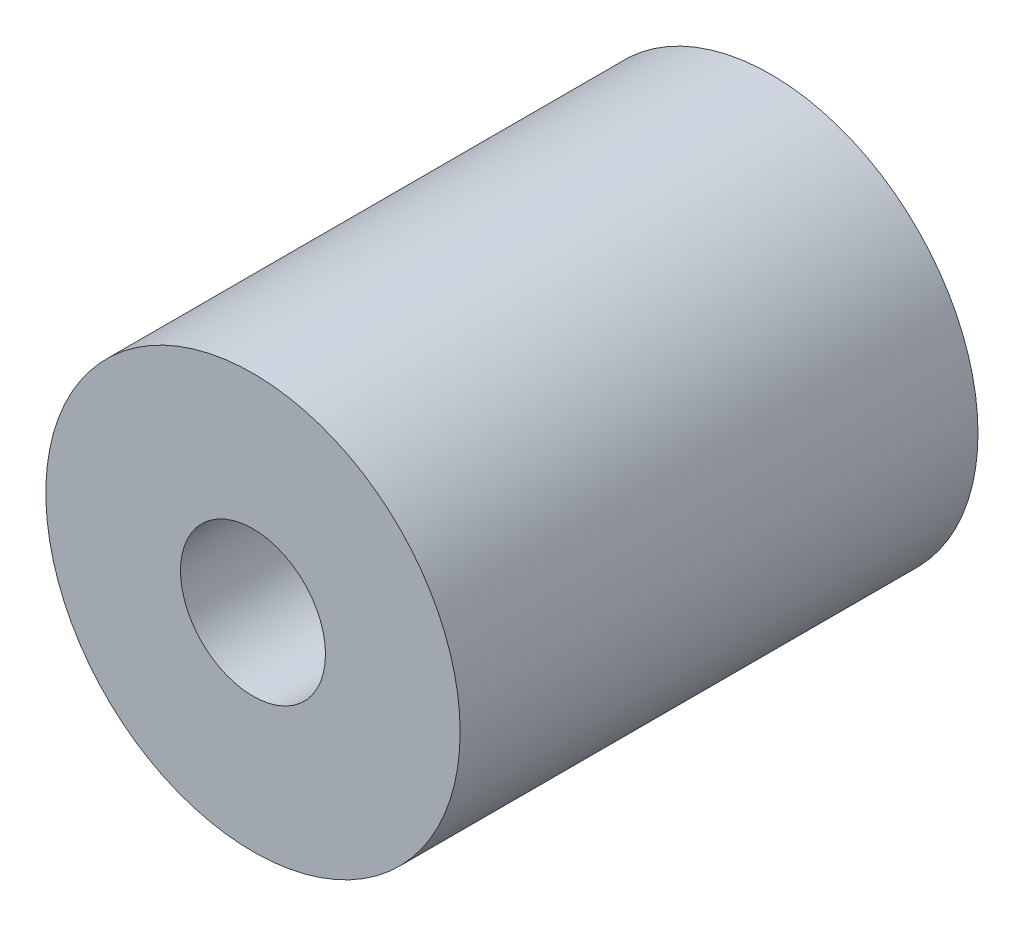
ISO-10303-21;
HEADER;
FILE_DESCRIPTION(('STEP AP214'),'2;1');
FILE_NAME('part.step','',(''),(''),'','','');
FILE_SCHEMA(('AUTOMOTIVE_DESIGN { 1 0 10303 214 1 1 1 1 }'));
ENDSEC;
DATA;
#1=APPLICATION_CONTEXT('core data for automotive mechanical design processes');
#2=APPLICATION_PROTOCOL_DEFINITION('international standard','automotive_design',2000,#1);
#3=PRODUCT_CONTEXT('',#1,'mechanical');
#4=PRODUCT('Part','Part','',(#3));
#5=PRODUCT_RELATED_PRODUCT_CATEGORY('part','',(#4));
#6=PRODUCT_DEFINITION_FORMATION('','',#4);
#7=PRODUCT_DEFINITION_CONTEXT('part definition',#1,'design');
#8=PRODUCT_DEFINITION('design','',#6,#7);
#9=PRODUCT_DEFINITION_SHAPE('','',#8);
#10=(LENGTH_UNIT() NAMED_UNIT(*) SI_UNIT(.MILLI.,.METRE.));
#11=(NAMED_UNIT(*) PLANE_ANGLE_UNIT() SI_UNIT($,.RADIAN.));
#12=(NAMED_UNIT(*) SI_UNIT($,.STERADIAN.) SOLID_ANGLE_UNIT());
#13=UNCERTAINTY_MEASURE_WITH_UNIT(LENGTH_MEASURE(1.E-05),#10,'distance_accuracy_value','');
#14=(GEOMETRIC_REPRESENTATION_CONTEXT(3) GLOBAL_UNCERTAINTY_ASSIGNED_CONTEXT((#13)) GLOBAL_UNIT_ASSIGNED_CONTEXT((#10,
#11,#12)) REPRESENTATION_CONTEXT('',''));
#15=CARTESIAN_POINT('',(0.,0.,0.));
#16=DIRECTION('',(0.,0.,1.));
#17=DIRECTION('',(1.,0.,0.));
#18=AXIS2_PLACEMENT_3D('',#15,#16,#17);
#19=CARTESIAN_POINT('',(21.1052464968056,-42.5537139426052,30.4705627484771));
#20=DIRECTION('',(0.,0.,-1.));
#21=DIRECTION('',(-1.,0.,0.));
#22=AXIS2_PLACEMENT_3D('',#19,#20,#21);
#23=CYLINDRICAL_SURFACE('',#22,5.99999999999999);
#24=CARTESIAN_POINT('',(21.1052464968056,-42.5537139426052,7.5));
#25=DIRECTION('',(0.,0.,1.));
#26=DIRECTION('',(1.,0.,0.));
#27=AXIS2_PLACEMENT_3D('',#24,#25,#26);
#28=CIRCLE('',#27,5.99999999999999);
#29=CARTESIAN_POINT('',(27.1052464968056,-42.5537139426052,7.5));
#30=VERTEX_POINT('',#29);
#31=EDGE_CURVE('E11',#30,#30,#28,.T.);
#32=ORIENTED_EDGE('',*,*,#31,.F.);
#33=EDGE_LOOP('',(#32));
#34=FACE_BOUND('',#33,.T.);
#35=CARTESIAN_POINT('',(21.1052464968056,-42.5537139426052,-7.5));
#36=DIRECTION('',(0.,0.,1.));
#37=DIRECTION('',(1.,0.,0.));
#38=AXIS2_PLACEMENT_3D('',#35,#36,#37);
#39=CIRCLE('',#38,5.99999999999999);
#40=CARTESIAN_POINT('',(27.1052464968056,-42.5537139426052,-7.5));
#41=VERTEX_POINT('',#40);
#42=EDGE_CURVE('E42',#41,#41,#39,.F.);
#43=ORIENTED_EDGE('',*,*,#42,.F.);
#44=EDGE_LOOP('',(#43));
#45=FACE_BOUND('',#44,.T.);
#46=ADVANCED_FACE('F35',(#34,#45),#23,.T.);
#47=CARTESIAN_POINT('',(0.,0.,7.5));
#48=DIRECTION('',(0.,0.,1.));
#49=DIRECTION('',(1.,0.,0.));
#50=AXIS2_PLACEMENT_3D('',#47,#48,#49);
#51=PLANE('',#50);
#52=CARTESIAN_POINT('',(21.1052464968056,-42.5537139426052,7.5));
#53=DIRECTION('',(0.,0.,1.));
#54=DIRECTION('',(1.,0.,0.));
#55=AXIS2_PLACEMENT_3D('',#52,#53,#54);
#56=CIRCLE('',#55,2.09999999999999);
#57=CARTESIAN_POINT('',(23.2052464968056,-42.5537139426052,7.5));
#58=VERTEX_POINT('',#57);
#59=EDGE_CURVE('E50',#58,#58,#56,.T.);
#60=ORIENTED_EDGE('',*,*,#59,.F.);
#61=EDGE_LOOP('',(#60));
#62=FACE_BOUND('',#61,.T.);
#63=ORIENTED_EDGE('',*,*,#31,.T.);
#64=EDGE_LOOP('',(#63));
#65=FACE_BOUND('',#64,.T.);
#66=ADVANCED_FACE('F37',(#62,#65),#51,.T.);
#67=CARTESIAN_POINT('',(0.,0.,-7.5));
#68=DIRECTION('',(0.,0.,1.));
#69=DIRECTION('',(1.,0.,0.));
#70=AXIS2_PLACEMENT_3D('',#67,#68,#69);
#71=PLANE('',#70);
#72=CARTESIAN_POINT('',(21.1052464968056,-42.5537139426052,-7.5));
#73=DIRECTION('',(0.,0.,1.));
#74=DIRECTION('',(1.,0.,0.));
#75=AXIS2_PLACEMENT_3D('',#72,#73,#74);
#76=CIRCLE('',#75,2.09999999999999);
#77=CARTESIAN_POINT('',(23.2052464968056,-42.5537139426052,-7.5));
#78=VERTEX_POINT('',#77);
#79=EDGE_CURVE('E46',#78,#78,#76,.T.);
#80=ORIENTED_EDGE('',*,*,#79,.T.);
#81=EDGE_LOOP('',(#80));
#82=FACE_BOUND('',#81,.T.);
#83=ORIENTED_EDGE('',*,*,#42,.T.);
#84=EDGE_LOOP('',(#83));
#85=FACE_BOUND('',#84,.T.);
#86=ADVANCED_FACE('F60',(#82,#85),#71,.F.);
#87=CARTESIAN_POINT('',(21.1052464968056,-42.5537139426052,7.5));
#88=DIRECTION('',(0.,0.,1.));
#89=DIRECTION('',(1.,0.,0.));
#90=AXIS2_PLACEMENT_3D('',#87,#88,#89);
#91=CYLINDRICAL_SURFACE('',#90,2.09999999999999);
#92=ORIENTED_EDGE('',*,*,#59,.T.);
#93=EDGE_LOOP('',(#92));
#94=FACE_BOUND('',#93,.T.);
#95=ORIENTED_EDGE('',*,*,#79,.F.);
#96=EDGE_LOOP('',(#95));
#97=FACE_BOUND('',#96,.T.);
#98=ADVANCED_FACE('F56',(#94,#97),#91,.F.);
#99=CLOSED_SHELL('',(#46,#66,#86,#98));
#100=MANIFOLD_SOLID_BREP('B2',#99);
#101=ADVANCED_BREP_SHAPE_REPRESENTATION('',(#18,#100),#14);
#102=SHAPE_DEFINITION_REPRESENTATION(#9,#101);
ENDSEC;
END-ISO-10303-21;
